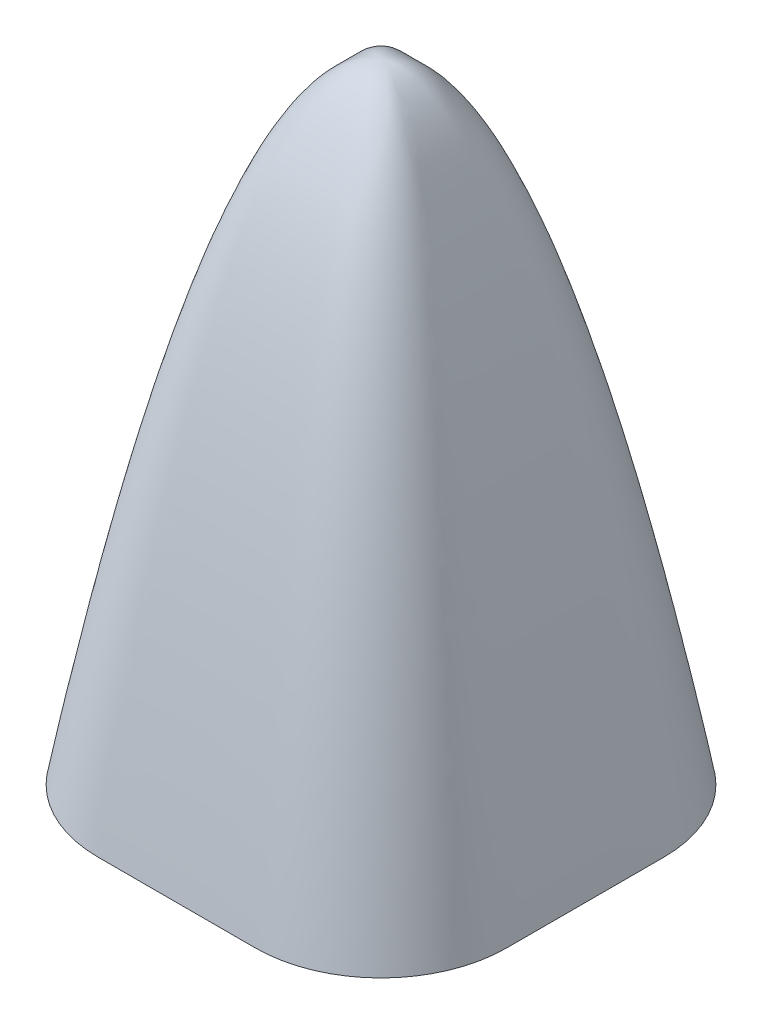
ISO-10303-21;
HEADER;
FILE_DESCRIPTION(('STEP AP214'),'2;1');
FILE_NAME('part.step','',(''),(''),'','','');
FILE_SCHEMA(('AUTOMOTIVE_DESIGN { 1 0 10303 214 1 1 1 1 }'));
ENDSEC;
DATA;
#1=APPLICATION_CONTEXT('core data for automotive mechanical design processes');
#2=APPLICATION_PROTOCOL_DEFINITION('international standard','automotive_design',2000,#1);
#3=PRODUCT_CONTEXT('',#1,'mechanical');
#4=PRODUCT('Part','Part','',(#3));
#5=PRODUCT_RELATED_PRODUCT_CATEGORY('part','',(#4));
#6=PRODUCT_DEFINITION_FORMATION('','',#4);
#7=PRODUCT_DEFINITION_CONTEXT('part definition',#1,'design');
#8=PRODUCT_DEFINITION('design','',#6,#7);
#9=PRODUCT_DEFINITION_SHAPE('','',#8);
#10=(LENGTH_UNIT() NAMED_UNIT(*) SI_UNIT(.MILLI.,.METRE.));
#11=(NAMED_UNIT(*) PLANE_ANGLE_UNIT() SI_UNIT($,.RADIAN.));
#12=(NAMED_UNIT(*) SI_UNIT($,.STERADIAN.) SOLID_ANGLE_UNIT());
#13=UNCERTAINTY_MEASURE_WITH_UNIT(LENGTH_MEASURE(1.E-05),#10,'distance_accuracy_value','');
#14=(GEOMETRIC_REPRESENTATION_CONTEXT(3) GLOBAL_UNCERTAINTY_ASSIGNED_CONTEXT((#13)) GLOBAL_UNIT_ASSIGNED_CONTEXT((#10,
#11,#12)) REPRESENTATION_CONTEXT('',''));
#15=CARTESIAN_POINT('',(0.,0.,0.));
#16=DIRECTION('',(0.,0.,1.));
#17=DIRECTION('',(1.,0.,0.));
#18=AXIS2_PLACEMENT_3D('',#15,#16,#17);
#19=CARTESIAN_POINT('',(-2.5,0.,2.5));
#20=DIRECTION('',(0.,1.,0.));
#21=DIRECTION('',(0.,0.,1.));
#22=AXIS2_PLACEMENT_3D('',#19,#20,#21);
#23=PLANE('',#22);
#24=DIRECTION('',(0.,0.,1.));
#25=VECTOR('',#24,1.);
#26=CARTESIAN_POINT('',(-6.5,0.,-2.49999999999997));
#27=LINE('',#26,#25);
#28=CARTESIAN_POINT('',(-6.5,0.,-2.49999999999997));
#29=VERTEX_POINT('',#28);
#30=CARTESIAN_POINT('',(-6.5,0.,2.49999999999997));
#31=VERTEX_POINT('',#30);
#32=EDGE_CURVE('E201',#29,#31,#27,.T.);
#33=ORIENTED_EDGE('',*,*,#32,.F.);
#34=CARTESIAN_POINT('',(-2.5,0.,-2.5));
#35=DIRECTION('',(0.,1.,0.));
#36=DIRECTION('',(0.,0.,1.));
#37=AXIS2_PLACEMENT_3D('',#34,#35,#36);
#38=CIRCLE('',#37,4.);
#39=CARTESIAN_POINT('',(-2.49999999999997,0.,-6.5));
#40=VERTEX_POINT('',#39);
#41=EDGE_CURVE('E13',#40,#29,#38,.T.);
#42=ORIENTED_EDGE('',*,*,#41,.F.);
#43=DIRECTION('',(1.,0.,0.));
#44=VECTOR('',#43,1.);
#45=CARTESIAN_POINT('',(-2.49999999999997,0.,-6.5));
#46=LINE('',#45,#44);
#47=CARTESIAN_POINT('',(2.49999999999997,0.,-6.5));
#48=VERTEX_POINT('',#47);
#49=EDGE_CURVE('E169',#40,#48,#46,.T.);
#50=ORIENTED_EDGE('',*,*,#49,.T.);
#51=CARTESIAN_POINT('',(2.5,0.,-2.5));
#52=DIRECTION('',(0.,1.,0.));
#53=DIRECTION('',(0.,0.,1.));
#54=AXIS2_PLACEMENT_3D('',#51,#52,#53);
#55=CIRCLE('',#54,4.);
#56=CARTESIAN_POINT('',(6.5,0.,-2.49999999999997));
#57=VERTEX_POINT('',#56);
#58=EDGE_CURVE('E266',#57,#48,#55,.T.);
#59=ORIENTED_EDGE('',*,*,#58,.F.);
#60=DIRECTION('',(0.,0.,1.));
#61=VECTOR('',#60,1.);
#62=CARTESIAN_POINT('',(6.5,0.,-2.49999999999997));
#63=LINE('',#62,#61);
#64=CARTESIAN_POINT('',(6.5,0.,2.49999999999997));
#65=VERTEX_POINT('',#64);
#66=EDGE_CURVE('E258',#57,#65,#63,.T.);
#67=ORIENTED_EDGE('',*,*,#66,.T.);
#68=CARTESIAN_POINT('',(2.5,0.,2.5));
#69=DIRECTION('',(0.,1.,0.));
#70=DIRECTION('',(0.,0.,1.));
#71=AXIS2_PLACEMENT_3D('',#68,#69,#70);
#72=CIRCLE('',#71,4.);
#73=CARTESIAN_POINT('',(2.49999999999997,0.,6.5));
#74=VERTEX_POINT('',#73);
#75=EDGE_CURVE('E243',#74,#65,#72,.T.);
#76=ORIENTED_EDGE('',*,*,#75,.F.);
#77=DIRECTION('',(1.,0.,0.));
#78=VECTOR('',#77,1.);
#79=CARTESIAN_POINT('',(-2.49999999999997,0.,6.5));
#80=LINE('',#79,#78);
#81=CARTESIAN_POINT('',(-2.5,0.,6.5));
#82=VERTEX_POINT('',#81);
#83=EDGE_CURVE('E202',#82,#74,#80,.T.);
#84=ORIENTED_EDGE('',*,*,#83,.F.);
#85=CARTESIAN_POINT('',(-2.5,0.,2.5));
#86=DIRECTION('',(0.,1.,0.));
#87=DIRECTION('',(0.,0.,1.));
#88=AXIS2_PLACEMENT_3D('',#85,#86,#87);
#89=CIRCLE('',#88,4.);
#90=EDGE_CURVE('E203',#31,#82,#89,.T.);
#91=ORIENTED_EDGE('',*,*,#90,.F.);
#92=EDGE_LOOP('',(#33,#42,#50,#59,#67,#76,#84,#91));
#93=FACE_BOUND('',#92,.T.);
#94=ADVANCED_FACE('F154',(#93),#23,.F.);
#95=CARTESIAN_POINT('',(0.,0.,-6.5));
#96=CARTESIAN_POINT('',(0.,13.3333333333333,-4.33333333333333));
#97=CARTESIAN_POINT('',(0.,20.,-2.16666666666667));
#98=CARTESIAN_POINT('',(0.,20.,0.));
#99=CARTESIAN_POINT('',(-0.208333333333331,0.,-6.5));
#100=CARTESIAN_POINT('',(-0.138888888888887,13.3333333333333,-4.33333333333333));
#101=CARTESIAN_POINT('',(-0.0694444444444437,20.,-2.16666666666667));
#102=CARTESIAN_POINT('',(0.,20.,0.));
#103=CARTESIAN_POINT('',(-0.624999999999993,0.,-6.5));
#104=CARTESIAN_POINT('',(-0.416666666666662,13.3333333333333,-4.33333333333333));
#105=CARTESIAN_POINT('',(-0.208333333333331,20.,-2.16666666666667));
#106=CARTESIAN_POINT('',(0.,20.,0.));
#107=CARTESIAN_POINT('',(-1.24999999999999,0.,-6.5));
#108=CARTESIAN_POINT('',(-0.833333333333324,13.3333333333333,-4.33333333333333));
#109=CARTESIAN_POINT('',(-0.416666666666662,20.,-2.16666666666667));
#110=CARTESIAN_POINT('',(0.,20.,0.));
#111=CARTESIAN_POINT('',(-1.87499999999998,0.,-6.5));
#112=CARTESIAN_POINT('',(-1.24999999999999,13.3333333333333,-4.33333333333333));
#113=CARTESIAN_POINT('',(-0.624999999999993,20.,-2.16666666666667));
#114=CARTESIAN_POINT('',(0.,20.,0.));
#115=CARTESIAN_POINT('',(-2.29166666666664,0.,-6.5));
#116=CARTESIAN_POINT('',(-1.52777777777776,13.3333333333333,-4.33333333333333));
#117=CARTESIAN_POINT('',(-0.76388888888888,20.,-2.16666666666667));
#118=CARTESIAN_POINT('',(0.,20.,0.));
#119=CARTESIAN_POINT('',(-3.02359877219142,0.,-6.5));
#120=CARTESIAN_POINT('',(-2.01573251479428,13.3333333333333,-4.33333333333334));
#121=CARTESIAN_POINT('',(-1.00786625739714,20.,-2.16666666666667));
#122=CARTESIAN_POINT('',(0.,20.,0.));
#123=CARTESIAN_POINT('',(-4.07062167964768,0.,-6.29196002703282));
#124=CARTESIAN_POINT('',(-2.71374778643179,13.3333333333333,-4.19464001802188));
#125=CARTESIAN_POINT('',(-1.35687389321589,20.,-2.09732000901094));
#126=CARTESIAN_POINT('',(0.,20.,0.));
#127=CARTESIAN_POINT('',(-5.40212765733191,0.,-5.40212765733192));
#128=CARTESIAN_POINT('',(-3.60141843822128,13.3333333333333,-3.60141843822128));
#129=CARTESIAN_POINT('',(-1.80070921911064,20.,-1.80070921911064));
#130=CARTESIAN_POINT('',(0.,20.,0.));
#131=CARTESIAN_POINT('',(-6.29196002703282,0.,-4.07062167964768));
#132=CARTESIAN_POINT('',(-4.19464001802188,13.3333333333333,-2.71374778643178));
#133=CARTESIAN_POINT('',(-2.09732000901094,20.,-1.35687389321589));
#134=CARTESIAN_POINT('',(0.,20.,0.));
#135=CARTESIAN_POINT('',(-6.5,0.,-3.02359877219142));
#136=CARTESIAN_POINT('',(-4.33333333333334,13.3333333333333,-2.01573251479428));
#137=CARTESIAN_POINT('',(-2.16666666666667,20.,-1.00786625739714));
#138=CARTESIAN_POINT('',(0.,20.,0.));
#139=CARTESIAN_POINT('',(-6.5,0.,-2.08333333333331));
#140=CARTESIAN_POINT('',(-4.33333333333333,13.3333333333333,-1.38888888888887));
#141=CARTESIAN_POINT('',(-2.16666666666667,20.,-0.694444444444436));
#142=CARTESIAN_POINT('',(0.,20.,0.));
#143=CARTESIAN_POINT('',(-6.5,0.,-1.24999999999999));
#144=CARTESIAN_POINT('',(-4.33333333333333,13.3333333333333,-0.833333333333324));
#145=CARTESIAN_POINT('',(-2.16666666666667,20.,-0.416666666666662));
#146=CARTESIAN_POINT('',(0.,20.,0.));
#147=CARTESIAN_POINT('',(-6.50000000000001,0.,0.));
#148=CARTESIAN_POINT('',(-4.33333333333334,13.3333333333333,0.));
#149=CARTESIAN_POINT('',(-2.16666666666667,20.,0.));
#150=CARTESIAN_POINT('',(0.,20.,0.));
#151=CARTESIAN_POINT('',(-6.5,0.,1.24999999999998));
#152=CARTESIAN_POINT('',(-4.33333333333333,13.3333333333333,0.833333333333323));
#153=CARTESIAN_POINT('',(-2.16666666666667,20.,0.416666666666661));
#154=CARTESIAN_POINT('',(0.,20.,0.));
#155=CARTESIAN_POINT('',(-6.5,0.,2.08333333333331));
#156=CARTESIAN_POINT('',(-4.33333333333333,13.3333333333333,1.38888888888887));
#157=CARTESIAN_POINT('',(-2.16666666666667,20.,0.694444444444436));
#158=CARTESIAN_POINT('',(0.,20.,0.));
#159=CARTESIAN_POINT('',(-6.50000000000001,0.,3.02359877219142));
#160=CARTESIAN_POINT('',(-4.33333333333334,13.3333333333333,2.01573251479428));
#161=CARTESIAN_POINT('',(-2.16666666666667,20.,1.00786625739714));
#162=CARTESIAN_POINT('',(0.,20.,0.));
#163=CARTESIAN_POINT('',(-6.29196002703282,0.,4.07062167964768));
#164=CARTESIAN_POINT('',(-4.19464001802188,13.3333333333333,2.71374778643178));
#165=CARTESIAN_POINT('',(-2.09732000901094,20.,1.35687389321589));
#166=CARTESIAN_POINT('',(0.,20.,0.));
#167=CARTESIAN_POINT('',(-5.40212765733193,0.,5.40212765733189));
#168=CARTESIAN_POINT('',(-3.60141843822128,13.3333333333333,3.60141843822126));
#169=CARTESIAN_POINT('',(-1.80070921911064,20.,1.80070921911063));
#170=CARTESIAN_POINT('',(0.,20.,0.));
#171=CARTESIAN_POINT('',(-4.0706216796477,0.,6.29196002703282));
#172=CARTESIAN_POINT('',(-2.7137477864318,13.3333333333333,4.19464001802188));
#173=CARTESIAN_POINT('',(-1.3568738932159,20.,2.09732000901094));
#174=CARTESIAN_POINT('',(0.,20.,0.));
#175=CARTESIAN_POINT('',(-3.02359877219145,0.,6.5));
#176=CARTESIAN_POINT('',(-2.0157325147943,13.3333333333333,4.33333333333333));
#177=CARTESIAN_POINT('',(-1.00786625739715,20.,2.16666666666667));
#178=CARTESIAN_POINT('',(0.,20.,0.));
#179=CARTESIAN_POINT('',(-2.08333333333334,0.,6.5));
#180=CARTESIAN_POINT('',(-1.38888888888889,13.3333333333333,4.33333333333333));
#181=CARTESIAN_POINT('',(-0.694444444444445,20.,2.16666666666667));
#182=CARTESIAN_POINT('',(0.,20.,0.));
#183=CARTESIAN_POINT('',(-1.25000000000001,0.,6.5));
#184=CARTESIAN_POINT('',(-0.833333333333339,13.3333333333333,4.33333333333333));
#185=CARTESIAN_POINT('',(-0.416666666666669,20.,2.16666666666667));
#186=CARTESIAN_POINT('',(0.,20.,0.));
#187=CARTESIAN_POINT('',(0.,0.,6.5));
#188=CARTESIAN_POINT('',(0.,13.3333333333333,4.33333333333333));
#189=CARTESIAN_POINT('',(0.,20.,2.16666666666667));
#190=CARTESIAN_POINT('',(0.,20.,0.));
#191=CARTESIAN_POINT('',(1.24999999999998,0.,6.5));
#192=CARTESIAN_POINT('',(0.833333333333319,13.3333333333333,4.33333333333333));
#193=CARTESIAN_POINT('',(0.41666666666666,20.,2.16666666666667));
#194=CARTESIAN_POINT('',(0.,20.,0.));
#195=CARTESIAN_POINT('',(2.08333333333331,0.,6.5));
#196=CARTESIAN_POINT('',(1.38888888888887,13.3333333333333,4.33333333333333));
#197=CARTESIAN_POINT('',(0.694444444444436,20.,2.16666666666667));
#198=CARTESIAN_POINT('',(0.,20.,0.));
#199=CARTESIAN_POINT('',(3.02359877219142,0.,6.5));
#200=CARTESIAN_POINT('',(2.01573251479428,13.3333333333333,4.33333333333334));
#201=CARTESIAN_POINT('',(1.00786625739714,20.,2.16666666666667));
#202=CARTESIAN_POINT('',(0.,20.,0.));
#203=CARTESIAN_POINT('',(4.07062167964767,0.,6.29196002703281));
#204=CARTESIAN_POINT('',(2.71374778643178,13.3333333333333,4.19464001802188));
#205=CARTESIAN_POINT('',(1.35687389321589,20.,2.09732000901094));
#206=CARTESIAN_POINT('',(0.,20.,0.));
#207=CARTESIAN_POINT('',(5.40212765733193,0.,5.40212765733192));
#208=CARTESIAN_POINT('',(3.60141843822129,13.3333333333333,3.60141843822128));
#209=CARTESIAN_POINT('',(1.80070921911064,20.,1.80070921911064));
#210=CARTESIAN_POINT('',(0.,20.,0.));
#211=CARTESIAN_POINT('',(6.2919600270328,0.,4.07062167964767));
#212=CARTESIAN_POINT('',(4.19464001802187,13.3333333333333,2.71374778643178));
#213=CARTESIAN_POINT('',(2.09732000901093,20.,1.35687389321589));
#214=CARTESIAN_POINT('',(0.,20.,0.));
#215=CARTESIAN_POINT('',(6.5,0.,3.02359877219142));
#216=CARTESIAN_POINT('',(4.33333333333334,13.3333333333333,2.01573251479428));
#217=CARTESIAN_POINT('',(2.16666666666667,20.,1.00786625739714));
#218=CARTESIAN_POINT('',(0.,20.,0.));
#219=CARTESIAN_POINT('',(6.5,0.,2.08333333333331));
#220=CARTESIAN_POINT('',(4.33333333333333,13.3333333333333,1.38888888888887));
#221=CARTESIAN_POINT('',(2.16666666666667,20.,0.694444444444436));
#222=CARTESIAN_POINT('',(0.,20.,0.));
#223=CARTESIAN_POINT('',(6.5,0.,1.24999999999999));
#224=CARTESIAN_POINT('',(4.33333333333334,13.3333333333333,0.833333333333324));
#225=CARTESIAN_POINT('',(2.16666666666667,20.,0.416666666666662));
#226=CARTESIAN_POINT('',(0.,20.,0.));
#227=CARTESIAN_POINT('',(6.5,0.,0.));
#228=CARTESIAN_POINT('',(4.33333333333333,13.3333333333333,0.));
#229=CARTESIAN_POINT('',(2.16666666666667,20.,0.));
#230=CARTESIAN_POINT('',(0.,20.,0.));
#231=CARTESIAN_POINT('',(6.5,0.,-1.24999999999999));
#232=CARTESIAN_POINT('',(4.33333333333333,13.3333333333333,-0.833333333333324));
#233=CARTESIAN_POINT('',(2.16666666666667,20.,-0.416666666666662));
#234=CARTESIAN_POINT('',(0.,20.,0.));
#235=CARTESIAN_POINT('',(6.5,0.,-2.08333333333331));
#236=CARTESIAN_POINT('',(4.33333333333333,13.3333333333333,-1.38888888888887));
#237=CARTESIAN_POINT('',(2.16666666666667,20.,-0.694444444444436));
#238=CARTESIAN_POINT('',(0.,20.,0.));
#239=CARTESIAN_POINT('',(6.5,0.,-3.02359877219142));
#240=CARTESIAN_POINT('',(4.33333333333334,13.3333333333333,-2.01573251479428));
#241=CARTESIAN_POINT('',(2.16666666666667,20.,-1.00786625739714));
#242=CARTESIAN_POINT('',(0.,20.,0.));
#243=CARTESIAN_POINT('',(6.29196002703282,0.,-4.07062167964766));
#244=CARTESIAN_POINT('',(4.19464001802188,13.3333333333333,-2.71374778643178));
#245=CARTESIAN_POINT('',(2.09732000901094,20.,-1.35687389321589));
#246=CARTESIAN_POINT('',(0.,20.,0.));
#247=CARTESIAN_POINT('',(5.40212765733191,0.,-5.40212765733193));
#248=CARTESIAN_POINT('',(3.60141843822128,13.3333333333333,-3.60141843822128));
#249=CARTESIAN_POINT('',(1.80070921911064,20.,-1.80070921911064));
#250=CARTESIAN_POINT('',(0.,20.,0.));
#251=CARTESIAN_POINT('',(4.07062167964768,0.,-6.29196002703281));
#252=CARTESIAN_POINT('',(2.71374778643179,13.3333333333333,-4.19464001802187));
#253=CARTESIAN_POINT('',(1.35687389321589,20.,-2.09732000901094));
#254=CARTESIAN_POINT('',(0.,20.,0.));
#255=CARTESIAN_POINT('',(3.02359877219142,0.,-6.5));
#256=CARTESIAN_POINT('',(2.01573251479428,13.3333333333333,-4.33333333333334));
#257=CARTESIAN_POINT('',(1.00786625739714,20.,-2.16666666666667));
#258=CARTESIAN_POINT('',(0.,20.,0.));
#259=CARTESIAN_POINT('',(2.29166666666664,0.,-6.5));
#260=CARTESIAN_POINT('',(1.52777777777776,13.3333333333333,-4.33333333333333));
#261=CARTESIAN_POINT('',(0.763888888888881,20.,-2.16666666666667));
#262=CARTESIAN_POINT('',(0.,20.,0.));
#263=CARTESIAN_POINT('',(1.87499999999998,0.,-6.50000000000001));
#264=CARTESIAN_POINT('',(1.24999999999999,13.3333333333333,-4.33333333333334));
#265=CARTESIAN_POINT('',(0.624999999999993,20.,-2.16666666666667));
#266=CARTESIAN_POINT('',(0.,20.,0.));
#267=CARTESIAN_POINT('',(1.24999999999999,0.,-6.49999999999999));
#268=CARTESIAN_POINT('',(0.833333333333327,13.3333333333333,-4.33333333333333));
#269=CARTESIAN_POINT('',(0.416666666666663,20.,-2.16666666666666));
#270=CARTESIAN_POINT('',(0.,20.,0.));
#271=CARTESIAN_POINT('',(0.624999999999994,0.,-6.50000000000001));
#272=CARTESIAN_POINT('',(0.416666666666662,13.3333333333333,-4.33333333333334));
#273=CARTESIAN_POINT('',(0.208333333333331,20.,-2.16666666666667));
#274=CARTESIAN_POINT('',(0.,20.,0.));
#275=CARTESIAN_POINT('',(0.208333333333332,0.,-6.5));
#276=CARTESIAN_POINT('',(0.138888888888888,13.3333333333333,-4.33333333333333));
#277=CARTESIAN_POINT('',(0.0694444444444439,20.,-2.16666666666667));
#278=CARTESIAN_POINT('',(0.,20.,0.));
#279=CARTESIAN_POINT('',(0.,0.,-6.5));
#280=CARTESIAN_POINT('',(0.,13.3333333333333,-4.33333333333333));
#281=CARTESIAN_POINT('',(0.,20.,-2.16666666666667));
#282=CARTESIAN_POINT('',(0.,20.,0.));
#283=B_SPLINE_SURFACE_WITH_KNOTS('',3,3,((#95,#96,#97,#98),(#99,#100,#101,#102),(#103,#104,#105,
#106),(#107,#108,#109,#110),(#111,#112,#113,#114),(#115,#116,#117,#118),(#119,#120,#121,#122),
(#123,#124,#125,#126),(#127,#128,#129,#130),(#131,#132,#133,#134),(#135,#136,#137,#138),(#139,
#140,#141,#142),(#143,#144,#145,#146),(#147,#148,#149,#150),(#151,#152,#153,#154),(#155,#156,
#157,#158),(#159,#160,#161,#162),(#163,#164,#165,#166),(#167,#168,#169,#170),(#171,#172,#173,
#174),(#175,#176,#177,#178),(#179,#180,#181,#182),(#183,#184,#185,#186),(#187,#188,#189,#190),
(#191,#192,#193,#194),(#195,#196,#197,#198),(#199,#200,#201,#202),(#203,#204,#205,#206),(#207,
#208,#209,#210),(#211,#212,#213,#214),(#215,#216,#217,#218),(#219,#220,#221,#222),(#223,#224,
#225,#226),(#227,#228,#229,#230),(#231,#232,#233,#234),(#235,#236,#237,#238),(#239,#240,#241,
#242),(#243,#244,#245,#246),(#247,#248,#249,#250),(#251,#252,#253,#254),(#255,#256,#257,#258),
(#259,#260,#261,#262),(#263,#264,#265,#266),(#267,#268,#269,#270),(#271,#272,#273,#274),(#275,
#276,#277,#278),(#279,#280,#281,#282)),.UNSPECIFIED.,.T.,.F.,.F.,(4,1,1,1,2,1,1,1,2,1,1,1,2,1,1,
1,2,1,1,1,2,1,1,1,2,1,1,1,2,1,1,1,2,1,1,1,4),(4,4),(0.,0.0138480398704943,0.0276960797409886,
0.0415441196114829,0.0553921594819772,0.0901960797409886,0.125,0.159803920259011,
0.194607840518023,0.222303920259011,0.25,0.277696079740989,0.305392159481977,0.340196079740988,
0.375,0.409803920259011,0.444607840518022,0.472303920259011,0.5,0.527696079740988,
0.555392159481977,0.590196079740989,0.625,0.659803920259011,0.694607840518023,0.722303920259011,
0.75,0.777696079740989,0.805392159481977,0.840196079740989,0.875,0.909803920259011,
0.944607840518023,0.958455880388517,0.972303920259011,0.986151960129506,1.),(0.,1.),.UNSPECIFIED.);
#284=CARTESIAN_POINT('',(0.,0.,6.5));
#285=CARTESIAN_POINT('',(0.,13.3333333333333,4.33333333333333));
#286=CARTESIAN_POINT('',(0.,20.,2.16666666666667));
#287=CARTESIAN_POINT('',(0.,20.,0.));
#288=CARTESIAN_POINT('',(0.41666666666665,0.,6.5));
#289=CARTESIAN_POINT('',(0.277777777777766,13.3333333333333,4.33333333333333));
#290=CARTESIAN_POINT('',(0.138888888888883,20.,2.16666666666667));
#291=CARTESIAN_POINT('',(0.,20.,0.));
#292=CARTESIAN_POINT('',(1.24999999999998,0.,6.5));
#293=CARTESIAN_POINT('',(0.833333333333319,13.3333333333333,4.33333333333333));
#294=CARTESIAN_POINT('',(0.41666666666666,20.,2.16666666666667));
#295=CARTESIAN_POINT('',(0.,20.,0.));
#296=CARTESIAN_POINT('',(2.08333333333331,0.,6.5));
#297=CARTESIAN_POINT('',(1.38888888888887,13.3333333333333,4.33333333333333));
#298=CARTESIAN_POINT('',(0.694444444444436,20.,2.16666666666667));
#299=CARTESIAN_POINT('',(0.,20.,0.));
#300=CARTESIAN_POINT('',(3.02359877219142,0.,6.5));
#301=CARTESIAN_POINT('',(2.01573251479428,13.3333333333333,4.33333333333334));
#302=CARTESIAN_POINT('',(1.00786625739714,20.,2.16666666666667));
#303=CARTESIAN_POINT('',(0.,20.,0.));
#304=CARTESIAN_POINT('',(4.07062167964767,0.,6.29196002703281));
#305=CARTESIAN_POINT('',(2.71374778643178,13.3333333333333,4.19464001802188));
#306=CARTESIAN_POINT('',(1.35687389321589,20.,2.09732000901094));
#307=CARTESIAN_POINT('',(0.,20.,0.));
#308=CARTESIAN_POINT('',(5.40212765733193,0.,5.40212765733192));
#309=CARTESIAN_POINT('',(3.60141843822129,13.3333333333333,3.60141843822128));
#310=CARTESIAN_POINT('',(1.80070921911064,20.,1.80070921911064));
#311=CARTESIAN_POINT('',(0.,20.,0.));
#312=CARTESIAN_POINT('',(6.2919600270328,0.,4.07062167964767));
#313=CARTESIAN_POINT('',(4.19464001802187,13.3333333333333,2.71374778643178));
#314=CARTESIAN_POINT('',(2.09732000901093,20.,1.35687389321589));
#315=CARTESIAN_POINT('',(0.,20.,0.));
#316=CARTESIAN_POINT('',(6.5,0.,3.02359877219142));
#317=CARTESIAN_POINT('',(4.33333333333334,13.3333333333333,2.01573251479428));
#318=CARTESIAN_POINT('',(2.16666666666667,20.,1.00786625739714));
#319=CARTESIAN_POINT('',(0.,20.,0.));
#320=CARTESIAN_POINT('',(6.5,0.,2.08333333333331));
#321=CARTESIAN_POINT('',(4.33333333333333,13.3333333333333,1.38888888888887));
#322=CARTESIAN_POINT('',(2.16666666666667,20.,0.694444444444436));
#323=CARTESIAN_POINT('',(0.,20.,0.));
#324=CARTESIAN_POINT('',(6.5,0.,1.24999999999999));
#325=CARTESIAN_POINT('',(4.33333333333334,13.3333333333333,0.833333333333324));
#326=CARTESIAN_POINT('',(2.16666666666667,20.,0.416666666666662));
#327=CARTESIAN_POINT('',(0.,20.,0.));
#328=CARTESIAN_POINT('',(6.5,0.,0.));
#329=CARTESIAN_POINT('',(4.33333333333333,13.3333333333333,0.));
#330=CARTESIAN_POINT('',(2.16666666666667,20.,0.));
#331=CARTESIAN_POINT('',(0.,20.,0.));
#332=CARTESIAN_POINT('',(6.5,0.,-1.24999999999999));
#333=CARTESIAN_POINT('',(4.33333333333333,13.3333333333333,-0.833333333333324));
#334=CARTESIAN_POINT('',(2.16666666666667,20.,-0.416666666666662));
#335=CARTESIAN_POINT('',(0.,20.,0.));
#336=CARTESIAN_POINT('',(6.5,0.,-2.08333333333331));
#337=CARTESIAN_POINT('',(4.33333333333333,13.3333333333333,-1.38888888888887));
#338=CARTESIAN_POINT('',(2.16666666666667,20.,-0.694444444444436));
#339=CARTESIAN_POINT('',(0.,20.,0.));
#340=CARTESIAN_POINT('',(6.5,0.,-3.02359877219142));
#341=CARTESIAN_POINT('',(4.33333333333334,13.3333333333333,-2.01573251479428));
#342=CARTESIAN_POINT('',(2.16666666666667,20.,-1.00786625739714));
#343=CARTESIAN_POINT('',(0.,20.,0.));
#344=CARTESIAN_POINT('',(6.29196002703282,0.,-4.07062167964766));
#345=CARTESIAN_POINT('',(4.19464001802188,13.3333333333333,-2.71374778643178));
#346=CARTESIAN_POINT('',(2.09732000901094,20.,-1.35687389321589));
#347=CARTESIAN_POINT('',(0.,20.,0.));
#348=CARTESIAN_POINT('',(5.40212765733191,0.,-5.40212765733193));
#349=CARTESIAN_POINT('',(3.60141843822128,13.3333333333333,-3.60141843822128));
#350=CARTESIAN_POINT('',(1.80070921911064,20.,-1.80070921911064));
#351=CARTESIAN_POINT('',(0.,20.,0.));
#352=CARTESIAN_POINT('',(4.07062167964768,0.,-6.29196002703281));
#353=CARTESIAN_POINT('',(2.71374778643179,13.3333333333333,-4.19464001802187));
#354=CARTESIAN_POINT('',(1.35687389321589,20.,-2.09732000901094));
#355=CARTESIAN_POINT('',(0.,20.,0.));
#356=CARTESIAN_POINT('',(3.02359877219142,0.,-6.5));
#357=CARTESIAN_POINT('',(2.01573251479428,13.3333333333333,-4.33333333333334));
#358=CARTESIAN_POINT('',(1.00786625739714,20.,-2.16666666666667));
#359=CARTESIAN_POINT('',(0.,20.,0.));
#360=CARTESIAN_POINT('',(2.29166666666664,0.,-6.5));
#361=CARTESIAN_POINT('',(1.52777777777776,13.3333333333333,-4.33333333333333));
#362=CARTESIAN_POINT('',(0.763888888888881,20.,-2.16666666666667));
#363=CARTESIAN_POINT('',(0.,20.,0.));
#364=CARTESIAN_POINT('',(1.87499999999998,0.,-6.50000000000001));
#365=CARTESIAN_POINT('',(1.24999999999999,13.3333333333333,-4.33333333333334));
#366=CARTESIAN_POINT('',(0.624999999999993,20.,-2.16666666666667));
#367=CARTESIAN_POINT('',(0.,20.,0.));
#368=CARTESIAN_POINT('',(1.24999999999999,0.,-6.49999999999999));
#369=CARTESIAN_POINT('',(0.833333333333327,13.3333333333333,-4.33333333333333));
#370=CARTESIAN_POINT('',(0.416666666666663,20.,-2.16666666666666));
#371=CARTESIAN_POINT('',(0.,20.,0.));
#372=CARTESIAN_POINT('',(0.624999999999994,0.,-6.50000000000001));
#373=CARTESIAN_POINT('',(0.416666666666662,13.3333333333333,-4.33333333333334));
#374=CARTESIAN_POINT('',(0.208333333333331,20.,-2.16666666666667));
#375=CARTESIAN_POINT('',(0.,20.,0.));
#376=CARTESIAN_POINT('',(0.208333333333332,0.,-6.5));
#377=CARTESIAN_POINT('',(0.138888888888888,13.3333333333333,-4.33333333333333));
#378=CARTESIAN_POINT('',(0.0694444444444439,20.,-2.16666666666667));
#379=CARTESIAN_POINT('',(0.,20.,0.));
#380=CARTESIAN_POINT('',(0.,0.,-6.5));
#381=CARTESIAN_POINT('',(0.,13.3333333333333,-4.33333333333333));
#382=CARTESIAN_POINT('',(0.,20.,-2.16666666666667));
#383=CARTESIAN_POINT('',(0.,20.,0.));
#384=CARTESIAN_POINT('',(-0.208333333333331,0.,-6.5));
#385=CARTESIAN_POINT('',(-0.138888888888887,13.3333333333333,-4.33333333333333));
#386=CARTESIAN_POINT('',(-0.0694444444444437,20.,-2.16666666666667));
#387=CARTESIAN_POINT('',(0.,20.,0.));
#388=CARTESIAN_POINT('',(-0.624999999999993,0.,-6.5));
#389=CARTESIAN_POINT('',(-0.416666666666662,13.3333333333333,-4.33333333333333));
#390=CARTESIAN_POINT('',(-0.208333333333331,20.,-2.16666666666667));
#391=CARTESIAN_POINT('',(0.,20.,0.));
#392=CARTESIAN_POINT('',(-1.24999999999999,0.,-6.5));
#393=CARTESIAN_POINT('',(-0.833333333333324,13.3333333333333,-4.33333333333333));
#394=CARTESIAN_POINT('',(-0.416666666666662,20.,-2.16666666666667));
#395=CARTESIAN_POINT('',(0.,20.,0.));
#396=CARTESIAN_POINT('',(-1.87499999999998,0.,-6.5));
#397=CARTESIAN_POINT('',(-1.24999999999999,13.3333333333333,-4.33333333333333));
#398=CARTESIAN_POINT('',(-0.624999999999993,20.,-2.16666666666667));
#399=CARTESIAN_POINT('',(0.,20.,0.));
#400=CARTESIAN_POINT('',(-2.29166666666664,0.,-6.5));
#401=CARTESIAN_POINT('',(-1.52777777777776,13.3333333333333,-4.33333333333333));
#402=CARTESIAN_POINT('',(-0.76388888888888,20.,-2.16666666666667));
#403=CARTESIAN_POINT('',(0.,20.,0.));
#404=CARTESIAN_POINT('',(-3.02359877219142,0.,-6.5));
#405=CARTESIAN_POINT('',(-2.01573251479428,13.3333333333333,-4.33333333333334));
#406=CARTESIAN_POINT('',(-1.00786625739714,20.,-2.16666666666667));
#407=CARTESIAN_POINT('',(0.,20.,0.));
#408=CARTESIAN_POINT('',(-4.07062167964768,0.,-6.29196002703282));
#409=CARTESIAN_POINT('',(-2.71374778643179,13.3333333333333,-4.19464001802188));
#410=CARTESIAN_POINT('',(-1.35687389321589,20.,-2.09732000901094));
#411=CARTESIAN_POINT('',(0.,20.,0.));
#412=CARTESIAN_POINT('',(-5.40212765733191,0.,-5.40212765733192));
#413=CARTESIAN_POINT('',(-3.60141843822128,13.3333333333333,-3.60141843822128));
#414=CARTESIAN_POINT('',(-1.80070921911064,20.,-1.80070921911064));
#415=CARTESIAN_POINT('',(0.,20.,0.));
#416=CARTESIAN_POINT('',(-6.29196002703282,0.,-4.07062167964768));
#417=CARTESIAN_POINT('',(-4.19464001802188,13.3333333333333,-2.71374778643178));
#418=CARTESIAN_POINT('',(-2.09732000901094,20.,-1.35687389321589));
#419=CARTESIAN_POINT('',(0.,20.,0.));
#420=CARTESIAN_POINT('',(-6.5,0.,-3.02359877219142));
#421=CARTESIAN_POINT('',(-4.33333333333334,13.3333333333333,-2.01573251479428));
#422=CARTESIAN_POINT('',(-2.16666666666667,20.,-1.00786625739714));
#423=CARTESIAN_POINT('',(0.,20.,0.));
#424=CARTESIAN_POINT('',(-6.5,0.,-2.08333333333331));
#425=CARTESIAN_POINT('',(-4.33333333333333,13.3333333333333,-1.38888888888887));
#426=CARTESIAN_POINT('',(-2.16666666666667,20.,-0.694444444444436));
#427=CARTESIAN_POINT('',(0.,20.,0.));
#428=CARTESIAN_POINT('',(-6.5,0.,-1.24999999999999));
#429=CARTESIAN_POINT('',(-4.33333333333333,13.3333333333333,-0.833333333333324));
#430=CARTESIAN_POINT('',(-2.16666666666667,20.,-0.416666666666662));
#431=CARTESIAN_POINT('',(0.,20.,0.));
#432=CARTESIAN_POINT('',(-6.50000000000001,0.,0.));
#433=CARTESIAN_POINT('',(-4.33333333333334,13.3333333333333,0.));
#434=CARTESIAN_POINT('',(-2.16666666666667,20.,0.));
#435=CARTESIAN_POINT('',(0.,20.,0.));
#436=CARTESIAN_POINT('',(-6.5,0.,1.24999999999998));
#437=CARTESIAN_POINT('',(-4.33333333333333,13.3333333333333,0.833333333333323));
#438=CARTESIAN_POINT('',(-2.16666666666667,20.,0.416666666666661));
#439=CARTESIAN_POINT('',(0.,20.,0.));
#440=CARTESIAN_POINT('',(-6.5,0.,2.08333333333331));
#441=CARTESIAN_POINT('',(-4.33333333333333,13.3333333333333,1.38888888888887));
#442=CARTESIAN_POINT('',(-2.16666666666667,20.,0.694444444444436));
#443=CARTESIAN_POINT('',(0.,20.,0.));
#444=CARTESIAN_POINT('',(-6.50000000000001,0.,3.02359877219142));
#445=CARTESIAN_POINT('',(-4.33333333333334,13.3333333333333,2.01573251479428));
#446=CARTESIAN_POINT('',(-2.16666666666667,20.,1.00786625739714));
#447=CARTESIAN_POINT('',(0.,20.,0.));
#448=CARTESIAN_POINT('',(-6.29196002703282,0.,4.07062167964768));
#449=CARTESIAN_POINT('',(-4.19464001802188,13.3333333333333,2.71374778643178));
#450=CARTESIAN_POINT('',(-2.09732000901094,20.,1.35687389321589));
#451=CARTESIAN_POINT('',(0.,20.,0.));
#452=CARTESIAN_POINT('',(-5.40212765733193,0.,5.40212765733189));
#453=CARTESIAN_POINT('',(-3.60141843822128,13.3333333333333,3.60141843822126));
#454=CARTESIAN_POINT('',(-1.80070921911064,20.,1.80070921911063));
#455=CARTESIAN_POINT('',(0.,20.,0.));
#456=CARTESIAN_POINT('',(-4.0706216796477,0.,6.29196002703282));
#457=CARTESIAN_POINT('',(-2.7137477864318,13.3333333333333,4.19464001802188));
#458=CARTESIAN_POINT('',(-1.3568738932159,20.,2.09732000901094));
#459=CARTESIAN_POINT('',(0.,20.,0.));
#460=CARTESIAN_POINT('',(-3.02359877219145,0.,6.5));
#461=CARTESIAN_POINT('',(-2.0157325147943,13.3333333333333,4.33333333333333));
#462=CARTESIAN_POINT('',(-1.00786625739715,20.,2.16666666666667));
#463=CARTESIAN_POINT('',(0.,20.,0.));
#464=CARTESIAN_POINT('',(-2.08333333333334,0.,6.5));
#465=CARTESIAN_POINT('',(-1.38888888888889,13.3333333333333,4.33333333333333));
#466=CARTESIAN_POINT('',(-0.694444444444445,20.,2.16666666666667));
#467=CARTESIAN_POINT('',(0.,20.,0.));
#468=CARTESIAN_POINT('',(-1.25000000000001,0.,6.5));
#469=CARTESIAN_POINT('',(-0.833333333333339,13.3333333333333,4.33333333333333));
#470=CARTESIAN_POINT('',(-0.416666666666669,20.,2.16666666666667));
#471=CARTESIAN_POINT('',(0.,20.,0.));
#472=CARTESIAN_POINT('',(-0.416666666666681,0.,6.5));
#473=CARTESIAN_POINT('',(-0.277777777777787,13.3333333333333,4.33333333333333));
#474=CARTESIAN_POINT('',(-0.138888888888894,20.,2.16666666666667));
#475=CARTESIAN_POINT('',(0.,20.,0.));
#476=CARTESIAN_POINT('',(0.,0.,6.5));
#477=CARTESIAN_POINT('',(0.,13.3333333333333,4.33333333333333));
#478=CARTESIAN_POINT('',(0.,20.,2.16666666666667));
#479=CARTESIAN_POINT('',(0.,20.,0.));
#480=B_SPLINE_SURFACE_WITH_KNOTS('',3,3,((#284,#285,#286,#287),(#288,#289,#290,#291),(#292,#293,
#294,#295),(#296,#297,#298,#299),(#300,#301,#302,#303),(#304,#305,#306,#307),(#308,#309,#310,
#311),(#312,#313,#314,#315),(#316,#317,#318,#319),(#320,#321,#322,#323),(#324,#325,#326,#327),
(#328,#329,#330,#331),(#332,#333,#334,#335),(#336,#337,#338,#339),(#340,#341,#342,#343),(#344,
#345,#346,#347),(#348,#349,#350,#351),(#352,#353,#354,#355),(#356,#357,#358,#359),(#360,#361,
#362,#363),(#364,#365,#366,#367),(#368,#369,#370,#371),(#372,#373,#374,#375),(#376,#377,#378,
#379),(#380,#381,#382,#383),(#384,#385,#386,#387),(#388,#389,#390,#391),(#392,#393,#394,#395),
(#396,#397,#398,#399),(#400,#401,#402,#403),(#404,#405,#406,#407),(#408,#409,#410,#411),(#412,
#413,#414,#415),(#416,#417,#418,#419),(#420,#421,#422,#423),(#424,#425,#426,#427),(#428,#429,
#430,#431),(#432,#433,#434,#435),(#436,#437,#438,#439),(#440,#441,#442,#443),(#444,#445,#446,
#447),(#448,#449,#450,#451),(#452,#453,#454,#455),(#456,#457,#458,#459),(#460,#461,#462,#463),
(#464,#465,#466,#467),(#468,#469,#470,#471),(#472,#473,#474,#475),(#476,#477,#478,#479)),
.UNSPECIFIED.,.T.,.F.,.F.,(4,1,2,1,1,1,2,1,1,1,2,1,1,1,2,1,1,1,3,1,1,1,2,1,1,1,2,1,1,1,2,1,1,1,
2,1,4),(4,4),(0.5,0.527696079740988,0.555392159481977,0.590196079740989,0.625,0.659803920259011,
0.694607840518023,0.722303920259011,0.75,0.777696079740989,0.805392159481977,0.840196079740989,
0.875,0.909803920259011,0.944607840518023,0.958455880388517,0.972303920259011,0.986151960129506,
1.,1.01384803987049,1.02769607974099,1.04154411961148,1.05539215948198,1.09019607974099,1.125,
1.15980392025901,1.19460784051802,1.22230392025901,1.25,1.27769607974099,1.30539215948198,
1.34019607974099,1.375,1.40980392025901,1.44460784051802,1.47230392025901,1.5),(0.,1.),.UNSPECIFIED.);
#481=CARTESIAN_POINT('',(0.,20.,0.));
#482=VERTEX_POINT('',#481);
#483=VERTEX_LOOP('',#482);
#484=FACE_BOUND('',#483,.T.);
#485=ORIENTED_EDGE('',*,*,#41,.T.);
#486=ORIENTED_EDGE('',*,*,#32,.T.);
#487=ORIENTED_EDGE('',*,*,#90,.T.);
#488=ORIENTED_EDGE('',*,*,#83,.T.);
#489=ORIENTED_EDGE('',*,*,#75,.T.);
#490=ORIENTED_EDGE('',*,*,#66,.F.);
#491=ORIENTED_EDGE('',*,*,#58,.T.);
#492=ORIENTED_EDGE('',*,*,#49,.F.);
#493=EDGE_LOOP('',(#485,#486,#487,#488,#489,#490,#491,#492));
#494=FACE_BOUND('',#493,.T.);
#495=ADVANCED_FACE('F160',(#484,#494),#480,.T.);
#496=CLOSED_SHELL('',(#94,#495));
#497=MANIFOLD_SOLID_BREP('B2',#496);
#498=ADVANCED_BREP_SHAPE_REPRESENTATION('',(#18,#497),#14);
#499=SHAPE_DEFINITION_REPRESENTATION(#9,#498);
ENDSEC;
END-ISO-10303-21;
